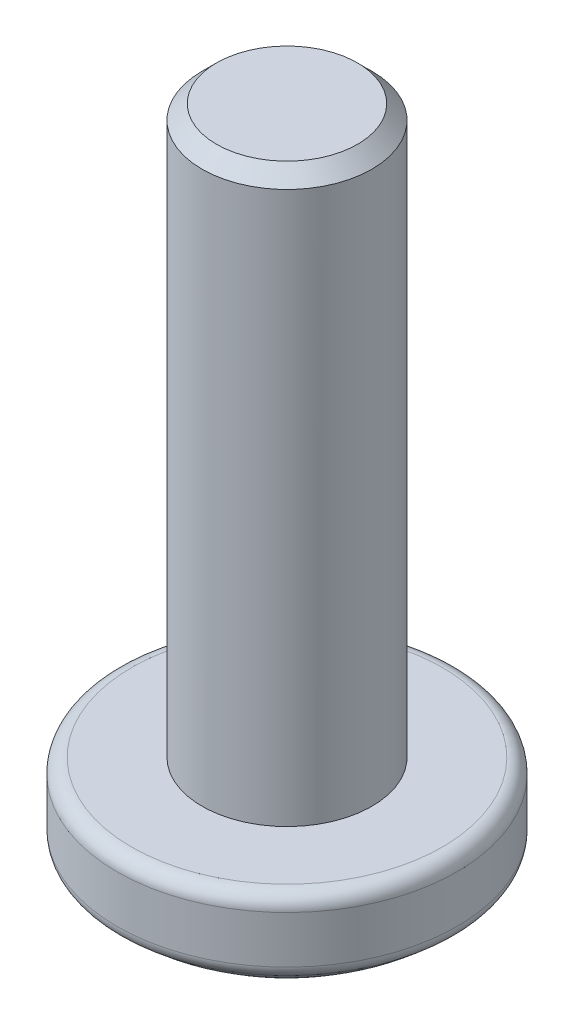
ISO-10303-21;
HEADER;
FILE_DESCRIPTION(('STEP AP214'),'2;1');
FILE_NAME('part.step','',(''),(''),'','','');
FILE_SCHEMA(('AUTOMOTIVE_DESIGN { 1 0 10303 214 1 1 1 1 }'));
ENDSEC;
DATA;
#1=APPLICATION_CONTEXT('core data for automotive mechanical design processes');
#2=APPLICATION_PROTOCOL_DEFINITION('international standard','automotive_design',2000,#1);
#3=PRODUCT_CONTEXT('',#1,'mechanical');
#4=PRODUCT('Part','Part','',(#3));
#5=PRODUCT_RELATED_PRODUCT_CATEGORY('part','',(#4));
#6=PRODUCT_DEFINITION_FORMATION('','',#4);
#7=PRODUCT_DEFINITION_CONTEXT('part definition',#1,'design');
#8=PRODUCT_DEFINITION('design','',#6,#7);
#9=PRODUCT_DEFINITION_SHAPE('','',#8);
#10=(LENGTH_UNIT() NAMED_UNIT(*) SI_UNIT(.MILLI.,.METRE.));
#11=(NAMED_UNIT(*) PLANE_ANGLE_UNIT() SI_UNIT($,.RADIAN.));
#12=(NAMED_UNIT(*) SI_UNIT($,.STERADIAN.) SOLID_ANGLE_UNIT());
#13=UNCERTAINTY_MEASURE_WITH_UNIT(LENGTH_MEASURE(1.E-05),#10,'distance_accuracy_value','');
#14=(GEOMETRIC_REPRESENTATION_CONTEXT(3) GLOBAL_UNCERTAINTY_ASSIGNED_CONTEXT((#13)) GLOBAL_UNIT_ASSIGNED_CONTEXT((#10,
#11,#12)) REPRESENTATION_CONTEXT('',''));
#15=CARTESIAN_POINT('',(0.,0.,0.));
#16=DIRECTION('',(0.,0.,1.));
#17=DIRECTION('',(1.,0.,0.));
#18=AXIS2_PLACEMENT_3D('',#15,#16,#17);
#19=CARTESIAN_POINT('',(0.,4.35,0.));
#20=DIRECTION('',(0.,-1.,0.));
#21=DIRECTION('',(-1.,0.,0.));
#22=AXIS2_PLACEMENT_3D('',#19,#20,#21);
#23=SPHERICAL_SURFACE('',#22,4.35);
#24=CARTESIAN_POINT('',(0.,1.122340386084,0.));
#25=DIRECTION('',(0.,1.,0.));
#26=DIRECTION('',(0.,0.,1.));
#27=AXIS2_PLACEMENT_3D('',#24,#25,#26);
#28=CIRCLE('',#27,2.9162841796875);
#29=CARTESIAN_POINT('',(0.,1.122340386084,2.9162841796875));
#30=VERTEX_POINT('',#29);
#31=EDGE_CURVE('E365',#30,#30,#28,.F.);
#32=ORIENTED_EDGE('',*,*,#31,.T.);
#33=EDGE_LOOP('',(#32));
#34=FACE_BOUND('',#33,.T.);
#35=CARTESIAN_POINT('',(0.258970656536856,4.30433648604077,0.));
#36=DIRECTION('',(0.984807753012208,-0.173648177666931,0.));
#37=DIRECTION('',(0.173648177666931,0.984807753012208,0.));
#38=AXIS2_PLACEMENT_3D('',#35,#36,#37);
#39=CIRCLE('',#38,4.34204433908105);
#40=CARTESIAN_POINT('',(-0.484894186436226,0.0856693258347679,0.709127301218796));
#41=VERTEX_POINT('',#40);
#42=CARTESIAN_POINT('',(-0.42720016888382,0.412868358680454,1.79972066016538));
#43=VERTEX_POINT('',#42);
#44=EDGE_CURVE('E11',#41,#43,#39,.F.);
#45=ORIENTED_EDGE('',*,*,#44,.T.);
#46=CARTESIAN_POINT('',(0.,0.412868358680454,0.));
#47=DIRECTION('',(0.,1.,0.));
#48=DIRECTION('',(0.,0.,1.));
#49=AXIS2_PLACEMENT_3D('',#46,#47,#48);
#50=CIRCLE('',#49,1.84972820676997);
#51=CARTESIAN_POINT('',(0.427200168883816,0.412868358680454,1.79972066016538));
#52=VERTEX_POINT('',#51);
#53=EDGE_CURVE('E382',#43,#52,#50,.T.);
#54=ORIENTED_EDGE('',*,*,#53,.T.);
#55=CARTESIAN_POINT('',(-0.258970656536853,4.30433648604077,0.));
#56=DIRECTION('',(-0.984807753012208,-0.173648177666931,0.));
#57=DIRECTION('',(0.173648177666931,-0.984807753012208,0.));
#58=AXIS2_PLACEMENT_3D('',#55,#56,#57);
#59=CIRCLE('',#58,4.34204433908105);
#60=CARTESIAN_POINT('',(0.484894186436226,0.0856693258347687,0.709127301218796));
#61=VERTEX_POINT('',#60);
#62=EDGE_CURVE('E51',#52,#61,#59,.F.);
#63=ORIENTED_EDGE('',*,*,#62,.T.);
#64=CARTESIAN_POINT('',(-0.0291757647507183,4.34443166091755,-0.012084997452354));
#65=DIRECTION('',(-0.909843726466414,-0.173648177666931,-0.376869611142454));
#66=DIRECTION('',(-0.38268343236508,0.,0.923879532511291));
#67=AXIS2_PLACEMENT_3D('',#64,#65,#66);
#68=CIRCLE('',#67,4.34988180542732);
#69=CARTESIAN_POINT('',(0.552581257723653,0.0707701735913865,0.552581257723651));
#70=VERTEX_POINT('',#69);
#71=EDGE_CURVE('E404',#61,#70,#68,.F.);
#72=ORIENTED_EDGE('',*,*,#71,.T.);
#73=CARTESIAN_POINT('',(-0.0120849974523541,4.34443166091755,-0.0291757647507182));
#74=DIRECTION('',(-0.376869611142458,-0.173648177666931,-0.909843726466412));
#75=DIRECTION('',(-0.923879532511289,0.,0.382683432365084));
#76=AXIS2_PLACEMENT_3D('',#73,#74,#75);
#77=CIRCLE('',#76,4.34988180542732);
#78=CARTESIAN_POINT('',(0.709127301218798,0.0856693258347687,0.484894186436223));
#79=VERTEX_POINT('',#78);
#80=EDGE_CURVE('E406',#70,#79,#77,.F.);
#81=ORIENTED_EDGE('',*,*,#80,.T.);
#82=CARTESIAN_POINT('',(0.,4.30433648604077,-0.258970656536856));
#83=DIRECTION('',(0.,-0.173648177666931,-0.984807753012208));
#84=DIRECTION('',(0.,0.984807753012208,-0.173648177666931));
#85=AXIS2_PLACEMENT_3D('',#82,#83,#84);
#86=CIRCLE('',#85,4.34204433908105);
#87=CARTESIAN_POINT('',(1.79972066016538,0.412868358680454,0.427200168883813));
#88=VERTEX_POINT('',#87);
#89=EDGE_CURVE('E317',#79,#88,#86,.F.);
#90=ORIENTED_EDGE('',*,*,#89,.T.);
#91=CARTESIAN_POINT('',(0.,0.412868358680454,0.));
#92=DIRECTION('',(0.,1.,0.));
#93=DIRECTION('',(0.,0.,1.));
#94=AXIS2_PLACEMENT_3D('',#91,#92,#93);
#95=CIRCLE('',#94,1.84972820676997);
#96=CARTESIAN_POINT('',(1.79972066016538,0.412868358680454,-0.427200168883797));
#97=VERTEX_POINT('',#96);
#98=EDGE_CURVE('E380',#88,#97,#95,.T.);
#99=ORIENTED_EDGE('',*,*,#98,.T.);
#100=CARTESIAN_POINT('',(0.,4.30433648604077,0.258970656536853));
#101=DIRECTION('',(0.,-0.173648177666931,0.984807753012208));
#102=DIRECTION('',(0.,-0.984807753012208,-0.173648177666931));
#103=AXIS2_PLACEMENT_3D('',#100,#101,#102);
#104=CIRCLE('',#103,4.34204433908105);
#105=CARTESIAN_POINT('',(0.709127301218801,0.0856693258347688,-0.484894186436219));
#106=VERTEX_POINT('',#105);
#107=EDGE_CURVE('E187',#97,#106,#104,.F.);
#108=ORIENTED_EDGE('',*,*,#107,.T.);
#109=CARTESIAN_POINT('',(-0.0120849974523544,4.34443166091755,0.0291757647507183));
#110=DIRECTION('',(-0.376869611142463,-0.173648177666931,0.90984372646641));
#111=DIRECTION('',(0.923879532511287,0.,0.38268343236509));
#112=AXIS2_PLACEMENT_3D('',#109,#110,#111);
#113=CIRCLE('',#112,4.34988180542732);
#114=CARTESIAN_POINT('',(0.552581257723657,0.0707701735913864,-0.552581257723647));
#115=VERTEX_POINT('',#114);
#116=EDGE_CURVE('E510',#106,#115,#113,.F.);
#117=ORIENTED_EDGE('',*,*,#116,.T.);
#118=CARTESIAN_POINT('',(-0.0291757647507181,4.34443166091755,0.0120849974523538));
#119=DIRECTION('',(-0.909843726466416,-0.173648177666931,0.376869611142448));
#120=DIRECTION('',(0.382683432365074,0.,0.923879532511293));
#121=AXIS2_PLACEMENT_3D('',#118,#119,#120);
#122=CIRCLE('',#121,4.34988180542732);
#123=CARTESIAN_POINT('',(0.48489418643623,0.0856693258347689,-0.709127301218794));
#124=VERTEX_POINT('',#123);
#125=EDGE_CURVE('E508',#115,#124,#122,.F.);
#126=ORIENTED_EDGE('',*,*,#125,.T.);
#127=CARTESIAN_POINT('',(-0.258970656536856,4.30433648604077,0.));
#128=DIRECTION('',(-0.984807753012208,-0.173648177666931,0.));
#129=DIRECTION('',(0.173648177666931,-0.984807753012208,0.));
#130=AXIS2_PLACEMENT_3D('',#127,#128,#129);
#131=CIRCLE('',#130,4.34204433908105);
#132=CARTESIAN_POINT('',(0.427200168883832,0.412868358680454,-1.79972066016537));
#133=VERTEX_POINT('',#132);
#134=EDGE_CURVE('E214',#124,#133,#131,.F.);
#135=ORIENTED_EDGE('',*,*,#134,.T.);
#136=CARTESIAN_POINT('',(0.,0.412868358680454,0.));
#137=DIRECTION('',(0.,1.,0.));
#138=DIRECTION('',(0.,0.,1.));
#139=AXIS2_PLACEMENT_3D('',#136,#137,#138);
#140=CIRCLE('',#139,1.84972820676997);
#141=CARTESIAN_POINT('',(-0.427200168883816,0.412868358680454,-1.79972066016538));
#142=VERTEX_POINT('',#141);
#143=EDGE_CURVE('E423',#133,#142,#140,.T.);
#144=ORIENTED_EDGE('',*,*,#143,.T.);
#145=CARTESIAN_POINT('',(0.258970656536853,4.30433648604077,0.));
#146=DIRECTION('',(0.984807753012208,-0.173648177666931,0.));
#147=DIRECTION('',(0.173648177666931,0.984807753012208,0.));
#148=AXIS2_PLACEMENT_3D('',#145,#146,#147);
#149=CIRCLE('',#148,4.34204433908105);
#150=CARTESIAN_POINT('',(-0.484894186436226,0.0856693258347687,-0.709127301218796));
#151=VERTEX_POINT('',#150);
#152=EDGE_CURVE('E248',#142,#151,#149,.F.);
#153=ORIENTED_EDGE('',*,*,#152,.T.);
#154=CARTESIAN_POINT('',(0.0291757647507183,4.34443166091755,0.012084997452354));
#155=DIRECTION('',(0.909843726466414,-0.173648177666931,0.376869611142454));
#156=DIRECTION('',(0.38268343236508,0.,-0.923879532511291));
#157=AXIS2_PLACEMENT_3D('',#154,#155,#156);
#158=CIRCLE('',#157,4.34988180542732);
#159=CARTESIAN_POINT('',(-0.552581257723653,0.0707701735913865,-0.552581257723651));
#160=VERTEX_POINT('',#159);
#161=EDGE_CURVE('E496',#151,#160,#158,.F.);
#162=ORIENTED_EDGE('',*,*,#161,.T.);
#163=CARTESIAN_POINT('',(0.0120849974523541,4.34443166091755,0.0291757647507182));
#164=DIRECTION('',(0.376869611142458,-0.173648177666931,0.909843726466412));
#165=DIRECTION('',(0.923879532511289,0.,-0.382683432365084));
#166=AXIS2_PLACEMENT_3D('',#163,#164,#165);
#167=CIRCLE('',#166,4.34988180542732);
#168=CARTESIAN_POINT('',(-0.709127301218798,0.0856693258347687,-0.484894186436223));
#169=VERTEX_POINT('',#168);
#170=EDGE_CURVE('E491',#160,#169,#167,.F.);
#171=ORIENTED_EDGE('',*,*,#170,.T.);
#172=CARTESIAN_POINT('',(0.,4.30433648604077,0.258970656536856));
#173=DIRECTION('',(0.,-0.173648177666931,0.984807753012208));
#174=DIRECTION('',(0.,-0.984807753012208,-0.173648177666931));
#175=AXIS2_PLACEMENT_3D('',#172,#173,#174);
#176=CIRCLE('',#175,4.34204433908105);
#177=CARTESIAN_POINT('',(-1.79972066016538,0.412868358680454,-0.427200168883813));
#178=VERTEX_POINT('',#177);
#179=EDGE_CURVE('E275',#169,#178,#176,.F.);
#180=ORIENTED_EDGE('',*,*,#179,.T.);
#181=CARTESIAN_POINT('',(0.,0.412868358680454,0.));
#182=DIRECTION('',(0.,1.,0.));
#183=DIRECTION('',(0.,0.,1.));
#184=AXIS2_PLACEMENT_3D('',#181,#182,#183);
#185=CIRCLE('',#184,1.84972820676997);
#186=CARTESIAN_POINT('',(-1.79972066016538,0.412868358680454,0.42720016888381));
#187=VERTEX_POINT('',#186);
#188=EDGE_CURVE('E417',#178,#187,#185,.T.);
#189=ORIENTED_EDGE('',*,*,#188,.T.);
#190=CARTESIAN_POINT('',(0.,4.30433648604077,-0.258970656536853));
#191=DIRECTION('',(0.,-0.173648177666931,-0.984807753012208));
#192=DIRECTION('',(0.,0.984807753012208,-0.173648177666931));
#193=AXIS2_PLACEMENT_3D('',#190,#191,#192);
#194=CIRCLE('',#193,4.34204433908105);
#195=CARTESIAN_POINT('',(-0.709127301218798,0.0856693258347687,0.484894186436224));
#196=VERTEX_POINT('',#195);
#197=EDGE_CURVE('E420',#187,#196,#194,.F.);
#198=ORIENTED_EDGE('',*,*,#197,.T.);
#199=CARTESIAN_POINT('',(0.0120849974523541,4.34443166091755,-0.0291757647507183));
#200=DIRECTION('',(0.376869611142457,-0.173648177666931,-0.909843726466412));
#201=DIRECTION('',(-0.92387953251129,0.,-0.382683432365083));
#202=AXIS2_PLACEMENT_3D('',#199,#200,#201);
#203=CIRCLE('',#202,4.34988180542732);
#204=CARTESIAN_POINT('',(-0.552581257723653,0.0707701735913865,0.552581257723651));
#205=VERTEX_POINT('',#204);
#206=EDGE_CURVE('E445',#196,#205,#203,.F.);
#207=ORIENTED_EDGE('',*,*,#206,.T.);
#208=CARTESIAN_POINT('',(0.029175764750718,4.34443166091755,-0.012084997452354));
#209=DIRECTION('',(0.909843726466413,-0.173648177666931,-0.376869611142455));
#210=DIRECTION('',(-0.382683432365081,0.,-0.923879532511291));
#211=AXIS2_PLACEMENT_3D('',#208,#209,#210);
#212=CIRCLE('',#211,4.34988180542732);
#213=EDGE_CURVE('E42',#205,#41,#212,.F.);
#214=ORIENTED_EDGE('',*,*,#213,.T.);
#215=EDGE_LOOP('',(#45,#54,#63,#72,#81,#90,#99,#108,#117,#126,#135,#144,#153,#162,#171,#180,
#189,#198,#207,#214));
#216=FACE_BOUND('',#215,.T.);
#217=ADVANCED_FACE('F32',(#34,#216),#23,.T.);
#218=CARTESIAN_POINT('',(1.5,12.4,0.));
#219=DIRECTION('',(0.,1.,0.));
#220=DIRECTION('',(0.,0.,1.));
#221=AXIS2_PLACEMENT_3D('',#218,#219,#220);
#222=PLANE('',#221);
#223=CARTESIAN_POINT('',(0.,12.4,0.));
#224=DIRECTION('',(0.,1.,0.));
#225=DIRECTION('',(0.,0.,1.));
#226=AXIS2_PLACEMENT_3D('',#223,#224,#225);
#227=CIRCLE('',#226,1.246);
#228=CARTESIAN_POINT('',(0.,12.4,1.246));
#229=VERTEX_POINT('',#228);
#230=EDGE_CURVE('E367',#229,#229,#227,.T.);
#231=ORIENTED_EDGE('',*,*,#230,.T.);
#232=EDGE_LOOP('',(#231));
#233=FACE_BOUND('',#232,.T.);
#234=ADVANCED_FACE('F336',(#233),#222,.T.);
#235=CARTESIAN_POINT('',(0.,0.,0.));
#236=DIRECTION('',(0.,-1.,0.));
#237=DIRECTION('',(0.,0.,-1.));
#238=AXIS2_PLACEMENT_3D('',#235,#236,#237);
#239=CYLINDRICAL_SURFACE('',#238,1.5);
#240=CARTESIAN_POINT('',(0.,12.146,0.));
#241=DIRECTION('',(0.,1.,0.));
#242=DIRECTION('',(0.,0.,1.));
#243=AXIS2_PLACEMENT_3D('',#240,#241,#242);
#244=CIRCLE('',#243,1.5);
#245=CARTESIAN_POINT('',(0.,12.146,1.5));
#246=VERTEX_POINT('',#245);
#247=EDGE_CURVE('E372',#246,#246,#244,.F.);
#248=ORIENTED_EDGE('',*,*,#247,.T.);
#249=EDGE_LOOP('',(#248));
#250=FACE_BOUND('',#249,.T.);
#251=CARTESIAN_POINT('',(0.,2.4,0.));
#252=DIRECTION('',(0.,-1.,0.));
#253=DIRECTION('',(0.,0.,-1.));
#254=AXIS2_PLACEMENT_3D('',#251,#252,#253);
#255=CIRCLE('',#254,1.5);
#256=CARTESIAN_POINT('',(0.,2.4,-1.5));
#257=VERTEX_POINT('',#256);
#258=EDGE_CURVE('E402',#257,#257,#255,.T.);
#259=ORIENTED_EDGE('',*,*,#258,.F.);
#260=EDGE_LOOP('',(#259));
#261=FACE_BOUND('',#260,.T.);
#262=ADVANCED_FACE('F342',(#250,#261),#239,.T.);
#263=CARTESIAN_POINT('',(3.,2.4,0.));
#264=DIRECTION('',(0.,1.,0.));
#265=DIRECTION('',(0.,0.,1.));
#266=AXIS2_PLACEMENT_3D('',#263,#264,#265);
#267=PLANE('',#266);
#268=CARTESIAN_POINT('',(0.,2.4,0.));
#269=DIRECTION('',(0.,1.,0.));
#270=DIRECTION('',(0.,0.,1.));
#271=AXIS2_PLACEMENT_3D('',#268,#269,#270);
#272=CIRCLE('',#271,2.746);
#273=CARTESIAN_POINT('',(0.,2.4,2.746));
#274=VERTEX_POINT('',#273);
#275=EDGE_CURVE('E377',#274,#274,#272,.T.);
#276=ORIENTED_EDGE('',*,*,#275,.T.);
#277=EDGE_LOOP('',(#276));
#278=FACE_BOUND('',#277,.T.);
#279=ORIENTED_EDGE('',*,*,#258,.T.);
#280=EDGE_LOOP('',(#279));
#281=FACE_BOUND('',#280,.T.);
#282=ADVANCED_FACE('F641',(#278,#281),#267,.T.);
#283=CARTESIAN_POINT('',(0.,0.,0.));
#284=DIRECTION('',(0.,-1.,0.));
#285=DIRECTION('',(0.,0.,-1.));
#286=AXIS2_PLACEMENT_3D('',#283,#284,#285);
#287=CYLINDRICAL_SURFACE('',#286,3.);
#288=CARTESIAN_POINT('',(0.,1.31080602790806,0.));
#289=DIRECTION('',(0.,1.,0.));
#290=DIRECTION('',(0.,0.,1.));
#291=AXIS2_PLACEMENT_3D('',#288,#289,#290);
#292=CIRCLE('',#291,3.);
#293=CARTESIAN_POINT('',(0.,1.31080602790806,3.));
#294=VERTEX_POINT('',#293);
#295=EDGE_CURVE('E363',#294,#294,#292,.T.);
#296=ORIENTED_EDGE('',*,*,#295,.T.);
#297=EDGE_LOOP('',(#296));
#298=FACE_BOUND('',#297,.T.);
#299=CARTESIAN_POINT('',(0.,2.146,0.));
#300=DIRECTION('',(0.,1.,0.));
#301=DIRECTION('',(0.,0.,1.));
#302=AXIS2_PLACEMENT_3D('',#299,#300,#301);
#303=CIRCLE('',#302,3.);
#304=CARTESIAN_POINT('',(0.,2.146,3.));
#305=VERTEX_POINT('',#304);
#306=EDGE_CURVE('E366',#305,#305,#303,.F.);
#307=ORIENTED_EDGE('',*,*,#306,.T.);
#308=EDGE_LOOP('',(#307));
#309=FACE_BOUND('',#308,.T.);
#310=ADVANCED_FACE('F352',(#298,#309),#287,.T.);
#311=CARTESIAN_POINT('',(0.,12.146,0.));
#312=DIRECTION('',(0.,-1.,0.));
#313=DIRECTION('',(0.,0.,-1.));
#314=AXIS2_PLACEMENT_3D('',#311,#312,#313);
#315=CONICAL_SURFACE('',#314,1.5,0.785398163397453);
#316=ORIENTED_EDGE('',*,*,#230,.F.);
#317=EDGE_LOOP('',(#316));
#318=FACE_BOUND('',#317,.T.);
#319=ORIENTED_EDGE('',*,*,#247,.F.);
#320=EDGE_LOOP('',(#319));
#321=FACE_BOUND('',#320,.T.);
#322=ADVANCED_FACE('F349',(#318,#321),#315,.T.);
#323=CARTESIAN_POINT('',(0.,1.31080602790806,0.));
#324=DIRECTION('',(0.,1.,0.));
#325=DIRECTION('',(0.,0.,1.));
#326=AXIS2_PLACEMENT_3D('',#323,#324,#325);
#327=TOROIDAL_SURFACE('',#326,2.746,0.254);
#328=ORIENTED_EDGE('',*,*,#295,.F.);
#329=EDGE_LOOP('',(#328));
#330=FACE_BOUND('',#329,.T.);
#331=ORIENTED_EDGE('',*,*,#31,.F.);
#332=EDGE_LOOP('',(#331));
#333=FACE_BOUND('',#332,.T.);
#334=ADVANCED_FACE('F351',(#330,#333),#327,.T.);
#335=CARTESIAN_POINT('',(0.,2.146,0.));
#336=DIRECTION('',(0.,1.,0.));
#337=DIRECTION('',(0.,0.,1.));
#338=AXIS2_PLACEMENT_3D('',#335,#336,#337);
#339=TOROIDAL_SURFACE('',#338,2.746,0.254);
#340=ORIENTED_EDGE('',*,*,#275,.F.);
#341=EDGE_LOOP('',(#340));
#342=FACE_BOUND('',#341,.T.);
#343=ORIENTED_EDGE('',*,*,#306,.F.);
#344=EDGE_LOOP('',(#343));
#345=FACE_BOUND('',#344,.T.);
#346=ADVANCED_FACE('F302',(#342,#345),#339,.T.);
#347=CARTESIAN_POINT('',(0.,0.,0.));
#348=DIRECTION('',(0.,-1.,0.));
#349=DIRECTION('',(0.,0.,-1.));
#350=AXIS2_PLACEMENT_3D('',#347,#348,#349);
#351=CONICAL_SURFACE('',#350,2.,0.349065850398867);
#352=ORIENTED_EDGE('',*,*,#53,.F.);
#353=CARTESIAN_POINT('',(-0.427200168883814,0.412868358680487,1.79972066016548));
#354=CARTESIAN_POINT('',(-0.389286175105566,0.627889302304162,1.72824125608089));
#355=CARTESIAN_POINT('',(-0.351385490847806,0.842834763886265,1.6565200732881));
#356=CARTESIAN_POINT('',(-0.275639714719868,1.27241040695347,1.51215063047957));
#357=CARTESIAN_POINT('',(-0.237794619982204,1.48704060470089,1.43950242029992));
#358=CARTESIAN_POINT('',(-0.181086343363749,1.80864922290898,1.32949453003816));
#359=CARTESIAN_POINT('',(-0.16219297484935,1.91579884027603,1.29265163946654));
#360=CARTESIAN_POINT('',(-0.124433168671837,2.12994534256285,1.21851297872001));
#361=CARTESIAN_POINT('',(-0.105566730840369,2.2369422284374,1.18121721139018));
#362=CARTESIAN_POINT('',(-0.0678678752263425,2.45074306290162,1.10603883061068));
#363=CARTESIAN_POINT('',(-0.0490354593591058,2.55754700062896,1.06815618520483));
#364=CARTESIAN_POINT('',(-0.0114205639153906,2.77087167330572,0.991570976083142));
#365=CARTESIAN_POINT('',(0.00736191456696406,2.87739240205006,0.952868394566499));
#366=CARTESIAN_POINT('',(0.0261115733701702,2.98372700114471,0.913639129514779));
#367=B_SPLINE_CURVE_WITH_KNOTS('',3,(#353,#354,#355,#356,#357,#358,#359,#360,#361,#362,#363,
#364,#365,#366),.UNSPECIFIED.,.F.,.F.,(4,2,2,2,2,2,4),(0.,0.689225785527144,1.37841467375089,
1.72302752905769,2.0676382205366,2.41226774287497,2.75690475479846),.UNSPECIFIED.);
#368=CARTESIAN_POINT('',(-0.147346038583071,2.,1.26349697131075));
#369=VERTEX_POINT('',#368);
#370=EDGE_CURVE('E436',#369,#43,#367,.F.);
#371=ORIENTED_EDGE('',*,*,#370,.F.);
#372=CARTESIAN_POINT('',(0.,2.,0.));
#373=DIRECTION('',(0.,1.,0.));
#374=DIRECTION('',(0.,0.,1.));
#375=AXIS2_PLACEMENT_3D('',#372,#373,#374);
#376=CIRCLE('',#375,1.27205953146759);
#377=CARTESIAN_POINT('',(0.14734603858307,2.,1.26349697131075));
#378=VERTEX_POINT('',#377);
#379=EDGE_CURVE('E385',#369,#378,#376,.T.);
#380=ORIENTED_EDGE('',*,*,#379,.T.);
#381=CARTESIAN_POINT('',(0.0961959809597622,2.29008639187146,1.16250344958252));
#382=CARTESIAN_POINT('',(0.128419405540513,2.10733826988083,1.22652723288619));
#383=CARTESIAN_POINT('',(0.160686194085589,1.92434421862769,1.28981873285545));
#384=CARTESIAN_POINT('',(0.225282776755482,1.5579987937225,1.41531573964388));
#385=CARTESIAN_POINT('',(0.257612569667517,1.37464742694846,1.47752126714199));
#386=CARTESIAN_POINT('',(0.32202293142225,1.00935811333385,1.6006733386335));
#387=CARTESIAN_POINT('',(0.354103139037547,0.827422215115655,1.66162616862896));
#388=CARTESIAN_POINT('',(0.418292632216687,0.46338550943832,1.78302283265837));
#389=CARTESIAN_POINT('',(0.450401917827159,0.281284701714742,1.84346666587453));
#390=CARTESIAN_POINT('',(0.514642878379865,-0.0830438899425974,1.96398191132411));
#391=CARTESIAN_POINT('',(0.546774554123209,-0.265271678419677,2.02405330938096));
#392=CARTESIAN_POINT('',(0.611054199733614,-0.629819663941435,2.14390330448741));
#393=CARTESIAN_POINT('',(0.643202169521065,-0.812139860534624,2.20368190295265));
#394=CARTESIAN_POINT('',(0.675356001070478,-0.994493300831864,2.26335535577293));
#395=B_SPLINE_CURVE_WITH_KNOTS('',3,(#381,#382,#383,#384,#385,#386,#387,#388,#389,#390,#391,
#392,#393,#394),.UNSPECIFIED.,.F.,.F.,(4,2,2,2,2,2,4),(0.,0.588898983680052,1.17778674136894,
1.76140022831259,2.34501465275221,2.92865115746137,3.51228483760131),.UNSPECIFIED.);
#396=EDGE_CURVE('E391',#378,#52,#395,.T.);
#397=ORIENTED_EDGE('',*,*,#396,.T.);
#398=EDGE_LOOP('',(#352,#371,#380,#397));
#399=FACE_BOUND('',#398,.T.);
#400=ADVANCED_FACE('F304',(#399),#351,.F.);
#401=CARTESIAN_POINT('',(0.5,0.,0.));
#402=DIRECTION('',(-0.984807753012208,-0.173648177666931,0.));
#403=DIRECTION('',(0.173648177666931,-0.984807753012208,0.));
#404=AXIS2_PLACEMENT_3D('',#401,#402,#403);
#405=PLANE('',#404);
#406=ORIENTED_EDGE('',*,*,#396,.F.);
#407=DIRECTION('',(0.,0.,-1.));
#408=VECTOR('',#407,1.);
#409=CARTESIAN_POINT('',(0.14734603858307,2.,0.));
#410=LINE('',#409,#408);
#411=CARTESIAN_POINT('',(0.14734603858307,2.,0.641984800024708));
#412=VERTEX_POINT('',#411);
#413=EDGE_CURVE('E387',#378,#412,#410,.T.);
#414=ORIENTED_EDGE('',*,*,#413,.T.);
#415=DIRECTION('',(0.173544683499998,-0.984220808424847,0.034520183841137));
#416=VECTOR('',#415,1.);
#417=CARTESIAN_POINT('',(0.495733763411424,0.0241950300029829,0.711283427136327));
#418=LINE('',#417,#416);
#419=EDGE_CURVE('E389',#412,#61,#418,.T.);
#420=ORIENTED_EDGE('',*,*,#419,.T.);
#421=ORIENTED_EDGE('',*,*,#62,.F.);
#422=EDGE_LOOP('',(#406,#414,#420,#421));
#423=FACE_BOUND('',#422,.T.);
#424=ADVANCED_FACE('F325',(#423),#405,.T.);
#425=CARTESIAN_POINT('',(0.678553390593272,0.,0.281066017177973));
#426=DIRECTION('',(-0.909843726466414,-0.173648177666931,-0.376869611142454));
#427=DIRECTION('',(-0.38268343236508,0.,0.923879532511291));
#428=AXIS2_PLACEMENT_3D('',#425,#426,#427);
#429=PLANE('',#428);
#430=ORIENTED_EDGE('',*,*,#419,.F.);
#431=DIRECTION('',(0.38268343236508,0.,-0.923879532511291));
#432=VECTOR('',#431,1.);
#433=CARTESIAN_POINT('',(0.352743613581143,2.,0.146111188785799));
#434=LINE('',#433,#432);
#435=CARTESIAN_POINT('',(0.292222377571608,2.,0.292222377571607));
#436=VERTEX_POINT('',#435);
#437=EDGE_CURVE('E413',#412,#436,#434,.T.);
#438=ORIENTED_EDGE('',*,*,#437,.T.);
#439=DIRECTION('',(0.13256209501801,-0.982270116581418,0.132562095018009));
#440=VECTOR('',#439,1.);
#441=CARTESIAN_POINT('',(0.559238781634994,0.0214386751140303,0.559238781634991));
#442=LINE('',#441,#440);
#443=EDGE_CURVE('E392',#436,#70,#442,.T.);
#444=ORIENTED_EDGE('',*,*,#443,.T.);
#445=ORIENTED_EDGE('',*,*,#71,.F.);
#446=EDGE_LOOP('',(#430,#438,#444,#445));
#447=FACE_BOUND('',#446,.T.);
#448=ADVANCED_FACE('F327',(#447),#429,.T.);
#449=CARTESIAN_POINT('',(0.281066017177976,0.,0.678553390593271));
#450=DIRECTION('',(-0.376869611142458,-0.173648177666931,-0.909843726466412));
#451=DIRECTION('',(-0.923879532511289,0.,0.382683432365084));
#452=AXIS2_PLACEMENT_3D('',#449,#450,#451);
#453=PLANE('',#452);
#454=ORIENTED_EDGE('',*,*,#443,.F.);
#455=DIRECTION('',(0.923879532511289,0.,-0.382683432365084));
#456=VECTOR('',#455,1.);
#457=CARTESIAN_POINT('',(0.146111188785801,2.,0.352743613581142));
#458=LINE('',#457,#456);
#459=CARTESIAN_POINT('',(0.641984800024709,2.,0.147346038583067));
#460=VERTEX_POINT('',#459);
#461=EDGE_CURVE('E411',#436,#460,#458,.T.);
#462=ORIENTED_EDGE('',*,*,#461,.T.);
#463=DIRECTION('',(0.0345201838411375,-0.984220808424847,0.173544683499998));
#464=VECTOR('',#463,1.);
#465=CARTESIAN_POINT('',(0.712688034162945,-0.0158523657356219,0.502795199787246));
#466=LINE('',#465,#464);
#467=EDGE_CURVE('E316',#460,#79,#466,.T.);
#468=ORIENTED_EDGE('',*,*,#467,.T.);
#469=ORIENTED_EDGE('',*,*,#80,.F.);
#470=EDGE_LOOP('',(#454,#462,#468,#469));
#471=FACE_BOUND('',#470,.T.);
#472=ADVANCED_FACE('F323',(#471),#453,.T.);
#473=CARTESIAN_POINT('',(0.,0.,0.499999999999998));
#474=DIRECTION('',(0.,-0.173648177666931,-0.984807753012208));
#475=DIRECTION('',(0.,0.984807753012208,-0.173648177666931));
#476=AXIS2_PLACEMENT_3D('',#473,#474,#475);
#477=PLANE('',#476);
#478=ORIENTED_EDGE('',*,*,#467,.F.);
#479=DIRECTION('',(1.,0.,0.));
#480=VECTOR('',#479,1.);
#481=CARTESIAN_POINT('',(0.,2.,0.147346038583067));
#482=LINE('',#481,#480);
#483=CARTESIAN_POINT('',(1.26349697131075,2.,0.147346038583067));
#484=VERTEX_POINT('',#483);
#485=EDGE_CURVE('E182',#460,#484,#482,.T.);
#486=ORIENTED_EDGE('',*,*,#485,.T.);
#487=CARTESIAN_POINT('',(1.79972066016548,0.412868358680487,0.427200168883808));
#488=CARTESIAN_POINT('',(1.72824125608089,0.627889302304162,0.38928617510556));
#489=CARTESIAN_POINT('',(1.6565200732881,0.842834763886265,0.3513854908478));
#490=CARTESIAN_POINT('',(1.51215063047957,1.27241040695347,0.275639714719863));
#491=CARTESIAN_POINT('',(1.43950242029992,1.48704060470089,0.237794619982199));
#492=CARTESIAN_POINT('',(1.32949453003816,1.80864922290898,0.181086343363745));
#493=CARTESIAN_POINT('',(1.29265163946654,1.91579884027603,0.162192974849346));
#494=CARTESIAN_POINT('',(1.21851297872001,2.12994534256285,0.124433168671832));
#495=CARTESIAN_POINT('',(1.18121721139018,2.2369422284374,0.105566730840364));
#496=CARTESIAN_POINT('',(1.10603883061068,2.45074306290162,0.0678678752263386));
#497=CARTESIAN_POINT('',(1.06815618520483,2.55754700062896,0.049035459359102));
#498=CARTESIAN_POINT('',(0.991570976083141,2.77087167330572,0.011420563915387));
#499=CARTESIAN_POINT('',(0.952868394566498,2.87739240205006,-0.00736191456696756));
#500=CARTESIAN_POINT('',(0.913639129514778,2.98372700114471,-0.0261115733701735));
#501=B_SPLINE_CURVE_WITH_KNOTS('',3,(#487,#488,#489,#490,#491,#492,#493,#494,#495,#496,#497,
#498,#499,#500),.UNSPECIFIED.,.F.,.F.,(4,2,2,2,2,2,4),(0.,0.689225785527144,1.37841467375089,
1.72302752905769,2.0676382205366,2.41226774287497,2.75690475479846),.UNSPECIFIED.);
#502=EDGE_CURVE('E179',#484,#88,#501,.F.);
#503=ORIENTED_EDGE('',*,*,#502,.T.);
#504=ORIENTED_EDGE('',*,*,#89,.F.);
#505=EDGE_LOOP('',(#478,#486,#503,#504));
#506=FACE_BOUND('',#505,.T.);
#507=ADVANCED_FACE('F301',(#506),#477,.T.);
#508=CARTESIAN_POINT('',(0.,0.,0.));
#509=DIRECTION('',(0.,-1.,0.));
#510=DIRECTION('',(0.,0.,-1.));
#511=AXIS2_PLACEMENT_3D('',#508,#509,#510);
#512=CONICAL_SURFACE('',#511,2.,0.349065850398867);
#513=ORIENTED_EDGE('',*,*,#502,.F.);
#514=CARTESIAN_POINT('',(0.,2.,0.));
#515=DIRECTION('',(0.,1.,0.));
#516=DIRECTION('',(0.,0.,1.));
#517=AXIS2_PLACEMENT_3D('',#514,#515,#516);
#518=CIRCLE('',#517,1.27205953146759);
#519=CARTESIAN_POINT('',(1.26349697131075,2.,-0.147346038583057));
#520=VERTEX_POINT('',#519);
#521=EDGE_CURVE('E175',#484,#520,#518,.T.);
#522=ORIENTED_EDGE('',*,*,#521,.T.);
#523=CARTESIAN_POINT('',(1.16250344958252,2.29008639187146,-0.0961959809597501));
#524=CARTESIAN_POINT('',(1.22652723288619,2.10733826988083,-0.1284194055405));
#525=CARTESIAN_POINT('',(1.28981873285545,1.92434421862769,-0.160686194085576));
#526=CARTESIAN_POINT('',(1.41531573964388,1.5579987937225,-0.225282776755467));
#527=CARTESIAN_POINT('',(1.47752126714199,1.37464742694846,-0.257612569667502));
#528=CARTESIAN_POINT('',(1.6006733386335,1.00935811333385,-0.322022931422233));
#529=CARTESIAN_POINT('',(1.66162616862896,0.827422215115656,-0.354103139037529));
#530=CARTESIAN_POINT('',(1.78302283265838,0.463385509438321,-0.418292632216669));
#531=CARTESIAN_POINT('',(1.84346666587454,0.281284701714743,-0.450401917827139));
#532=CARTESIAN_POINT('',(1.96398191132411,-0.0830438899425966,-0.514642878379844));
#533=CARTESIAN_POINT('',(2.02405330938096,-0.265271678419676,-0.546774554123188));
#534=CARTESIAN_POINT('',(2.14390330448742,-0.629819663941434,-0.611054199733591));
#535=CARTESIAN_POINT('',(2.20368190295266,-0.812139860534624,-0.643202169521042));
#536=CARTESIAN_POINT('',(2.26335535577294,-0.994493300831862,-0.675356001070455));
#537=B_SPLINE_CURVE_WITH_KNOTS('',3,(#523,#524,#525,#526,#527,#528,#529,#530,#531,#532,#533,
#534,#535,#536),.UNSPECIFIED.,.F.,.F.,(4,2,2,2,2,2,4),(0.,0.588898983680052,1.17778674136894,
1.76140022831259,2.34501465275221,2.92865115746137,3.51228483760131),.UNSPECIFIED.);
#538=EDGE_CURVE('E177',#520,#97,#537,.T.);
#539=ORIENTED_EDGE('',*,*,#538,.T.);
#540=ORIENTED_EDGE('',*,*,#98,.F.);
#541=EDGE_LOOP('',(#513,#522,#539,#540));
#542=FACE_BOUND('',#541,.T.);
#543=ADVANCED_FACE('F176',(#542),#512,.F.);
#544=CARTESIAN_POINT('',(0.,2.,0.));
#545=DIRECTION('',(0.,1.,0.));
#546=DIRECTION('',(0.,0.,1.));
#547=AXIS2_PLACEMENT_3D('',#544,#545,#546);
#548=PLANE('',#547);
#549=ORIENTED_EDGE('',*,*,#379,.F.);
#550=DIRECTION('',(0.,0.,1.));
#551=VECTOR('',#550,1.);
#552=CARTESIAN_POINT('',(-0.147346038583067,2.,0.));
#553=LINE('',#552,#551);
#554=CARTESIAN_POINT('',(-0.147346038583069,2.,0.641984800024709));
#555=VERTEX_POINT('',#554);
#556=EDGE_CURVE('E456',#555,#369,#553,.T.);
#557=ORIENTED_EDGE('',*,*,#556,.F.);
#558=DIRECTION('',(0.382683432365081,0.,0.923879532511291));
#559=VECTOR('',#558,1.);
#560=CARTESIAN_POINT('',(-0.352743613581143,2.,0.1461111887858));
#561=LINE('',#560,#559);
#562=CARTESIAN_POINT('',(-0.292222377571608,2.,0.292222377571607));
#563=VERTEX_POINT('',#562);
#564=EDGE_CURVE('E477',#563,#555,#561,.T.);
#565=ORIENTED_EDGE('',*,*,#564,.F.);
#566=DIRECTION('',(0.92387953251129,0.,0.382683432365083));
#567=VECTOR('',#566,1.);
#568=CARTESIAN_POINT('',(-0.1461111887858,2.,0.352743613581143));
#569=LINE('',#568,#567);
#570=CARTESIAN_POINT('',(-0.641984800024709,2.,0.147346038583067));
#571=VERTEX_POINT('',#570);
#572=EDGE_CURVE('E472',#571,#563,#569,.T.);
#573=ORIENTED_EDGE('',*,*,#572,.F.);
#574=DIRECTION('',(1.,0.,0.));
#575=VECTOR('',#574,1.);
#576=CARTESIAN_POINT('',(0.,2.,0.14734603858307));
#577=LINE('',#576,#575);
#578=CARTESIAN_POINT('',(-1.26349697131075,2.,0.147346038583065));
#579=VERTEX_POINT('',#578);
#580=EDGE_CURVE('E422',#579,#571,#577,.T.);
#581=ORIENTED_EDGE('',*,*,#580,.F.);
#582=CARTESIAN_POINT('',(0.,2.,0.));
#583=DIRECTION('',(0.,1.,0.));
#584=DIRECTION('',(0.,0.,1.));
#585=AXIS2_PLACEMENT_3D('',#582,#583,#584);
#586=CIRCLE('',#585,1.27205953146759);
#587=CARTESIAN_POINT('',(-1.26349697131075,2.,-0.147346038583067));
#588=VERTEX_POINT('',#587);
#589=EDGE_CURVE('E244',#588,#579,#586,.T.);
#590=ORIENTED_EDGE('',*,*,#589,.F.);
#591=DIRECTION('',(-1.,0.,0.));
#592=VECTOR('',#591,1.);
#593=CARTESIAN_POINT('',(0.,2.,-0.147346038583067));
#594=LINE('',#593,#592);
#595=CARTESIAN_POINT('',(-0.641984800024709,2.,-0.147346038583067));
#596=VERTEX_POINT('',#595);
#597=EDGE_CURVE('E274',#596,#588,#594,.T.);
#598=ORIENTED_EDGE('',*,*,#597,.F.);
#599=DIRECTION('',(-0.923879532511289,0.,0.382683432365084));
#600=VECTOR('',#599,1.);
#601=CARTESIAN_POINT('',(-0.146111188785801,2.,-0.352743613581142));
#602=LINE('',#601,#600);
#603=CARTESIAN_POINT('',(-0.292222377571608,2.,-0.292222377571607));
#604=VERTEX_POINT('',#603);
#605=EDGE_CURVE('E279',#604,#596,#602,.T.);
#606=ORIENTED_EDGE('',*,*,#605,.F.);
#607=DIRECTION('',(-0.38268343236508,0.,0.923879532511291));
#608=VECTOR('',#607,1.);
#609=CARTESIAN_POINT('',(-0.352743613581143,2.,-0.146111188785799));
#610=LINE('',#609,#608);
#611=CARTESIAN_POINT('',(-0.14734603858307,2.,-0.641984800024708));
#612=VERTEX_POINT('',#611);
#613=EDGE_CURVE('E281',#612,#604,#610,.T.);
#614=ORIENTED_EDGE('',*,*,#613,.F.);
#615=DIRECTION('',(0.,0.,1.));
#616=VECTOR('',#615,1.);
#617=CARTESIAN_POINT('',(-0.14734603858307,2.,0.));
#618=LINE('',#617,#616);
#619=CARTESIAN_POINT('',(-0.14734603858307,2.,-1.26349697131075));
#620=VERTEX_POINT('',#619);
#621=EDGE_CURVE('E283',#620,#612,#618,.T.);
#622=ORIENTED_EDGE('',*,*,#621,.F.);
#623=CARTESIAN_POINT('',(0.,2.,0.));
#624=DIRECTION('',(0.,1.,0.));
#625=DIRECTION('',(0.,0.,1.));
#626=AXIS2_PLACEMENT_3D('',#623,#624,#625);
#627=CIRCLE('',#626,1.27205953146759);
#628=CARTESIAN_POINT('',(0.14734603858308,2.,-1.26349697131075));
#629=VERTEX_POINT('',#628);
#630=EDGE_CURVE('E188',#629,#620,#627,.T.);
#631=ORIENTED_EDGE('',*,*,#630,.F.);
#632=DIRECTION('',(0.,0.,-1.));
#633=VECTOR('',#632,1.);
#634=CARTESIAN_POINT('',(0.147346038583067,2.,0.));
#635=LINE('',#634,#633);
#636=CARTESIAN_POINT('',(0.147346038583074,2.,-0.641984800024708));
#637=VERTEX_POINT('',#636);
#638=EDGE_CURVE('E199',#637,#629,#635,.T.);
#639=ORIENTED_EDGE('',*,*,#638,.F.);
#640=DIRECTION('',(-0.382683432365074,0.,-0.923879532511293));
#641=VECTOR('',#640,1.);
#642=CARTESIAN_POINT('',(0.352743613581144,2.,-0.146111188785797));
#643=LINE('',#642,#641);
#644=CARTESIAN_POINT('',(0.29222237757161,2.,-0.292222377571605));
#645=VERTEX_POINT('',#644);
#646=EDGE_CURVE('E195',#645,#637,#643,.T.);
#647=ORIENTED_EDGE('',*,*,#646,.F.);
#648=DIRECTION('',(-0.923879532511287,0.,-0.38268343236509));
#649=VECTOR('',#648,1.);
#650=CARTESIAN_POINT('',(0.146111188785803,2.,-0.352743613581142));
#651=LINE('',#650,#649);
#652=CARTESIAN_POINT('',(0.641984800024709,2.,-0.147346038583063));
#653=VERTEX_POINT('',#652);
#654=EDGE_CURVE('E194',#653,#645,#651,.T.);
#655=ORIENTED_EDGE('',*,*,#654,.F.);
#656=DIRECTION('',(-1.,0.,0.));
#657=VECTOR('',#656,1.);
#658=CARTESIAN_POINT('',(0.,2.,-0.14734603858307));
#659=LINE('',#658,#657);
#660=EDGE_CURVE('E36',#520,#653,#659,.T.);
#661=ORIENTED_EDGE('',*,*,#660,.F.);
#662=ORIENTED_EDGE('',*,*,#521,.F.);
#663=ORIENTED_EDGE('',*,*,#485,.F.);
#664=ORIENTED_EDGE('',*,*,#461,.F.);
#665=ORIENTED_EDGE('',*,*,#437,.F.);
#666=ORIENTED_EDGE('',*,*,#413,.F.);
#667=EDGE_LOOP('',(#549,#557,#565,#573,#581,#590,#598,#606,#614,#622,#631,#639,#647,#655,#661,
#662,#663,#664,#665,#666));
#668=FACE_BOUND('',#667,.T.);
#669=ADVANCED_FACE('F192',(#668),#548,.F.);
#670=CARTESIAN_POINT('',(0.,0.,0.));
#671=DIRECTION('',(0.,-1.,0.));
#672=DIRECTION('',(0.,0.,-1.));
#673=AXIS2_PLACEMENT_3D('',#670,#671,#672);
#674=CONICAL_SURFACE('',#673,2.,0.349065850398867);
#675=CARTESIAN_POINT('',(-1.79972066016548,0.412868358680487,-0.427200168883807));
#676=CARTESIAN_POINT('',(-1.72824125608089,0.627889302304162,-0.38928617510556));
#677=CARTESIAN_POINT('',(-1.6565200732881,0.842834763886266,-0.3513854908478));
#678=CARTESIAN_POINT('',(-1.51215063047957,1.27241040695347,-0.275639714719862));
#679=CARTESIAN_POINT('',(-1.43950242029992,1.48704060470089,-0.237794619982199));
#680=CARTESIAN_POINT('',(-1.32949453003816,1.80864922290898,-0.181086343363745));
#681=CARTESIAN_POINT('',(-1.29265163946654,1.91579884027603,-0.162192974849345));
#682=CARTESIAN_POINT('',(-1.21851297872001,2.12994534256285,-0.124433168671832));
#683=CARTESIAN_POINT('',(-1.18121721139018,2.2369422284374,-0.105566730840364));
#684=CARTESIAN_POINT('',(-1.10603883061068,2.45074306290162,-0.0678678752263386));
#685=CARTESIAN_POINT('',(-1.06815618520483,2.55754700062896,-0.049035459359102));
#686=CARTESIAN_POINT('',(-0.991570976083141,2.77087167330572,-0.011420563915387));
#687=CARTESIAN_POINT('',(-0.952868394566499,2.87739240205006,0.00736191456696753));
#688=CARTESIAN_POINT('',(-0.913639129514778,2.98372700114471,0.0261115733701735));
#689=B_SPLINE_CURVE_WITH_KNOTS('',3,(#675,#676,#677,#678,#679,#680,#681,#682,#683,#684,#685,
#686,#687,#688),.UNSPECIFIED.,.F.,.F.,(4,2,2,2,2,2,4),(0.,0.689225785527144,1.37841467375089,
1.72302752905769,2.0676382205366,2.41226774287497,2.75690475479846),.UNSPECIFIED.);
#690=EDGE_CURVE('E266',#588,#178,#689,.F.);
#691=ORIENTED_EDGE('',*,*,#690,.F.);
#692=ORIENTED_EDGE('',*,*,#589,.T.);
#693=CARTESIAN_POINT('',(-1.16250344958252,2.29008639187146,0.096195980959758));
#694=CARTESIAN_POINT('',(-1.22652723288619,2.10733826988083,0.128419405540508));
#695=CARTESIAN_POINT('',(-1.28981873285545,1.92434421862769,0.160686194085585));
#696=CARTESIAN_POINT('',(-1.41531573964388,1.5579987937225,0.225282776755477));
#697=CARTESIAN_POINT('',(-1.47752126714199,1.37464742694846,0.257612569667512));
#698=CARTESIAN_POINT('',(-1.6006733386335,1.00935811333385,0.322022931422245));
#699=CARTESIAN_POINT('',(-1.66162616862896,0.827422215115655,0.354103139037541));
#700=CARTESIAN_POINT('',(-1.78302283265838,0.46338550943832,0.418292632216681));
#701=CARTESIAN_POINT('',(-1.84346666587453,0.281284701714742,0.450401917827152));
#702=CARTESIAN_POINT('',(-1.96398191132411,-0.0830438899425979,0.514642878379858));
#703=CARTESIAN_POINT('',(-2.02405330938096,-0.265271678419677,0.546774554123202));
#704=CARTESIAN_POINT('',(-2.14390330448741,-0.629819663941435,0.611054199733607));
#705=CARTESIAN_POINT('',(-2.20368190295266,-0.812139860534624,0.643202169521057));
#706=CARTESIAN_POINT('',(-2.26335535577294,-0.994493300831864,0.675356001070471));
#707=B_SPLINE_CURVE_WITH_KNOTS('',3,(#693,#694,#695,#696,#697,#698,#699,#700,#701,#702,#703,
#704,#705,#706),.UNSPECIFIED.,.F.,.F.,(4,2,2,2,2,2,4),(0.,0.588898983680052,1.17778674136894,
1.76140022831259,2.34501465275221,2.92865115746137,3.51228483760131),.UNSPECIFIED.);
#708=EDGE_CURVE('E388',#579,#187,#707,.T.);
#709=ORIENTED_EDGE('',*,*,#708,.T.);
#710=ORIENTED_EDGE('',*,*,#188,.F.);
#711=EDGE_LOOP('',(#691,#692,#709,#710));
#712=FACE_BOUND('',#711,.T.);
#713=ADVANCED_FACE('F227',(#712),#674,.F.);
#714=CARTESIAN_POINT('',(0.,0.,0.5));
#715=DIRECTION('',(0.,-0.173648177666931,-0.984807753012208));
#716=DIRECTION('',(0.,0.984807753012208,-0.173648177666931));
#717=AXIS2_PLACEMENT_3D('',#714,#715,#716);
#718=PLANE('',#717);
#719=ORIENTED_EDGE('',*,*,#708,.F.);
#720=ORIENTED_EDGE('',*,*,#580,.T.);
#721=DIRECTION('',(-0.0345201838411377,-0.984220808424847,0.173544683499998));
#722=VECTOR('',#721,1.);
#723=CARTESIAN_POINT('',(-0.711283427136328,0.024195030002983,0.495733763411421));
#724=LINE('',#723,#722);
#725=EDGE_CURVE('E427',#571,#196,#724,.T.);
#726=ORIENTED_EDGE('',*,*,#725,.T.);
#727=ORIENTED_EDGE('',*,*,#197,.F.);
#728=EDGE_LOOP('',(#719,#720,#726,#727));
#729=FACE_BOUND('',#728,.T.);
#730=ADVANCED_FACE('F230',(#729),#718,.T.);
#731=CARTESIAN_POINT('',(-0.281066017177975,0.,0.678553390593271));
#732=DIRECTION('',(0.376869611142457,-0.173648177666931,-0.909843726466412));
#733=DIRECTION('',(-0.92387953251129,0.,-0.382683432365083));
#734=AXIS2_PLACEMENT_3D('',#731,#732,#733);
#735=PLANE('',#734);
#736=ORIENTED_EDGE('',*,*,#725,.F.);
#737=ORIENTED_EDGE('',*,*,#572,.T.);
#738=DIRECTION('',(-0.13256209501801,-0.982270116581418,0.132562095018009));
#739=VECTOR('',#738,1.);
#740=CARTESIAN_POINT('',(-0.559238781634993,0.0214386751140302,0.559238781634992));
#741=LINE('',#740,#739);
#742=EDGE_CURVE('E430',#563,#205,#741,.T.);
#743=ORIENTED_EDGE('',*,*,#742,.T.);
#744=ORIENTED_EDGE('',*,*,#206,.F.);
#745=EDGE_LOOP('',(#736,#737,#743,#744));
#746=FACE_BOUND('',#745,.T.);
#747=ADVANCED_FACE('F461',(#746),#735,.T.);
#748=CARTESIAN_POINT('',(-0.678553390593272,0.,0.281066017177974));
#749=DIRECTION('',(0.909843726466413,-0.173648177666931,-0.376869611142455));
#750=DIRECTION('',(-0.382683432365081,0.,-0.923879532511291));
#751=AXIS2_PLACEMENT_3D('',#748,#749,#750);
#752=PLANE('',#751);
#753=ORIENTED_EDGE('',*,*,#742,.F.);
#754=ORIENTED_EDGE('',*,*,#564,.T.);
#755=DIRECTION('',(-0.173544683499998,-0.984220808424847,0.0345201838411368));
#756=VECTOR('',#755,1.);
#757=CARTESIAN_POINT('',(-0.502795199787249,-0.0158523657356219,0.712688034162943));
#758=LINE('',#757,#756);
#759=EDGE_CURVE('E433',#555,#41,#758,.T.);
#760=ORIENTED_EDGE('',*,*,#759,.T.);
#761=ORIENTED_EDGE('',*,*,#213,.F.);
#762=EDGE_LOOP('',(#753,#754,#760,#761));
#763=FACE_BOUND('',#762,.T.);
#764=ADVANCED_FACE('F256',(#763),#752,.T.);
#765=CARTESIAN_POINT('',(-0.499999999999998,0.,0.));
#766=DIRECTION('',(0.984807753012208,-0.173648177666931,0.));
#767=DIRECTION('',(0.173648177666931,0.984807753012208,0.));
#768=AXIS2_PLACEMENT_3D('',#765,#766,#767);
#769=PLANE('',#768);
#770=ORIENTED_EDGE('',*,*,#759,.F.);
#771=ORIENTED_EDGE('',*,*,#556,.T.);
#772=ORIENTED_EDGE('',*,*,#370,.T.);
#773=ORIENTED_EDGE('',*,*,#44,.F.);
#774=EDGE_LOOP('',(#770,#771,#772,#773));
#775=FACE_BOUND('',#774,.T.);
#776=ADVANCED_FACE('F225',(#775),#769,.T.);
#777=CARTESIAN_POINT('',(0.,0.,0.));
#778=DIRECTION('',(0.,-1.,0.));
#779=DIRECTION('',(0.,0.,-1.));
#780=AXIS2_PLACEMENT_3D('',#777,#778,#779);
#781=CONICAL_SURFACE('',#780,2.,0.349065850398867);
#782=CARTESIAN_POINT('',(0.427200168883826,0.412868358680488,-1.79972066016548));
#783=CARTESIAN_POINT('',(0.389286175105578,0.627889302304163,-1.72824125608089));
#784=CARTESIAN_POINT('',(0.351385490847817,0.842834763886266,-1.6565200732881));
#785=CARTESIAN_POINT('',(0.275639714719878,1.27241040695347,-1.51215063047957));
#786=CARTESIAN_POINT('',(0.237794619982214,1.48704060470089,-1.43950242029992));
#787=CARTESIAN_POINT('',(0.181086343363759,1.80864922290898,-1.32949453003816));
#788=CARTESIAN_POINT('',(0.162192974849359,1.91579884027603,-1.29265163946654));
#789=CARTESIAN_POINT('',(0.124433168671845,2.12994534256285,-1.21851297872001));
#790=CARTESIAN_POINT('',(0.105566730840377,2.2369422284374,-1.18121721139018));
#791=CARTESIAN_POINT('',(0.0678678752263501,2.45074306290162,-1.10603883061068));
#792=CARTESIAN_POINT('',(0.0490354593591131,2.55754700062896,-1.06815618520483));
#793=CARTESIAN_POINT('',(0.0114205639153974,2.77087167330572,-0.991570976083141));
#794=CARTESIAN_POINT('',(-0.00736191456695753,2.87739240205006,-0.952868394566499));
#795=CARTESIAN_POINT('',(-0.026111573370164,2.98372700114471,-0.913639129514778));
#796=B_SPLINE_CURVE_WITH_KNOTS('',3,(#782,#783,#784,#785,#786,#787,#788,#789,#790,#791,#792,
#793,#794,#795),.UNSPECIFIED.,.F.,.F.,(4,2,2,2,2,2,4),(0.,0.689225785527144,1.37841467375089,
1.72302752905769,2.0676382205366,2.41226774287497,2.75690475479846),.UNSPECIFIED.);
#797=EDGE_CURVE('E204',#629,#133,#796,.F.);
#798=ORIENTED_EDGE('',*,*,#797,.F.);
#799=ORIENTED_EDGE('',*,*,#630,.T.);
#800=CARTESIAN_POINT('',(-0.0961959809597619,2.29008639187146,-1.16250344958252));
#801=CARTESIAN_POINT('',(-0.128419405540512,2.10733826988083,-1.22652723288619));
#802=CARTESIAN_POINT('',(-0.160686194085589,1.92434421862769,-1.28981873285544));
#803=CARTESIAN_POINT('',(-0.225282776755481,1.5579987937225,-1.41531573964388));
#804=CARTESIAN_POINT('',(-0.257612569667517,1.37464742694846,-1.47752126714199));
#805=CARTESIAN_POINT('',(-0.32202293142225,1.00935811333385,-1.6006733386335));
#806=CARTESIAN_POINT('',(-0.354103139037546,0.827422215115656,-1.66162616862896));
#807=CARTESIAN_POINT('',(-0.418292632216687,0.463385509438321,-1.78302283265837));
#808=CARTESIAN_POINT('',(-0.450401917827159,0.281284701714743,-1.84346666587453));
#809=CARTESIAN_POINT('',(-0.514642878379865,-0.0830438899425966,-1.96398191132411));
#810=CARTESIAN_POINT('',(-0.546774554123209,-0.265271678419676,-2.02405330938095));
#811=CARTESIAN_POINT('',(-0.611054199733614,-0.629819663941434,-2.14390330448741));
#812=CARTESIAN_POINT('',(-0.643202169521065,-0.812139860534623,-2.20368190295265));
#813=CARTESIAN_POINT('',(-0.675356001070478,-0.994493300831862,-2.26335535577293));
#814=B_SPLINE_CURVE_WITH_KNOTS('',3,(#800,#801,#802,#803,#804,#805,#806,#807,#808,#809,#810,
#811,#812,#813),.UNSPECIFIED.,.F.,.F.,(4,2,2,2,2,2,4),(0.,0.588898983680053,1.17778674136894,
1.76140022831259,2.34501465275221,2.92865115746137,3.51228483760131),.UNSPECIFIED.);
#815=EDGE_CURVE('E235',#620,#142,#814,.T.);
#816=ORIENTED_EDGE('',*,*,#815,.T.);
#817=ORIENTED_EDGE('',*,*,#143,.F.);
#818=EDGE_LOOP('',(#798,#799,#816,#817));
#819=FACE_BOUND('',#818,.T.);
#820=ADVANCED_FACE('F219',(#819),#781,.F.);
#821=CARTESIAN_POINT('',(-0.5,0.,0.));
#822=DIRECTION('',(0.984807753012208,-0.173648177666931,0.));
#823=DIRECTION('',(0.173648177666931,0.984807753012208,0.));
#824=AXIS2_PLACEMENT_3D('',#821,#822,#823);
#825=PLANE('',#824);
#826=ORIENTED_EDGE('',*,*,#815,.F.);
#827=ORIENTED_EDGE('',*,*,#621,.T.);
#828=DIRECTION('',(-0.173544683499998,-0.984220808424847,-0.034520183841137));
#829=VECTOR('',#828,1.);
#830=CARTESIAN_POINT('',(-0.495733763411424,0.0241950300029829,-0.711283427136327));
#831=LINE('',#830,#829);
#832=EDGE_CURVE('E245',#612,#151,#831,.T.);
#833=ORIENTED_EDGE('',*,*,#832,.T.);
#834=ORIENTED_EDGE('',*,*,#152,.F.);
#835=EDGE_LOOP('',(#826,#827,#833,#834));
#836=FACE_BOUND('',#835,.T.);
#837=ADVANCED_FACE('F224',(#836),#825,.T.);
#838=CARTESIAN_POINT('',(-0.678553390593272,0.,-0.281066017177973));
#839=DIRECTION('',(0.909843726466414,-0.173648177666931,0.376869611142454));
#840=DIRECTION('',(0.38268343236508,0.,-0.923879532511291));
#841=AXIS2_PLACEMENT_3D('',#838,#839,#840);
#842=PLANE('',#841);
#843=ORIENTED_EDGE('',*,*,#832,.F.);
#844=ORIENTED_EDGE('',*,*,#613,.T.);
#845=DIRECTION('',(-0.13256209501801,-0.982270116581418,-0.132562095018009));
#846=VECTOR('',#845,1.);
#847=CARTESIAN_POINT('',(-0.559238781634994,0.0214386751140303,-0.559238781634991));
#848=LINE('',#847,#846);
#849=EDGE_CURVE('E482',#604,#160,#848,.T.);
#850=ORIENTED_EDGE('',*,*,#849,.T.);
#851=ORIENTED_EDGE('',*,*,#161,.F.);
#852=EDGE_LOOP('',(#843,#844,#850,#851));
#853=FACE_BOUND('',#852,.T.);
#854=ADVANCED_FACE('F254',(#853),#842,.T.);
#855=CARTESIAN_POINT('',(-0.281066017177976,0.,-0.678553390593271));
#856=DIRECTION('',(0.376869611142458,-0.173648177666931,0.909843726466412));
#857=DIRECTION('',(0.923879532511289,0.,-0.382683432365084));
#858=AXIS2_PLACEMENT_3D('',#855,#856,#857);
#859=PLANE('',#858);
#860=ORIENTED_EDGE('',*,*,#849,.F.);
#861=ORIENTED_EDGE('',*,*,#605,.T.);
#862=DIRECTION('',(-0.0345201838411375,-0.984220808424847,-0.173544683499998));
#863=VECTOR('',#862,1.);
#864=CARTESIAN_POINT('',(-0.712688034162945,-0.0158523657356219,-0.502795199787246));
#865=LINE('',#864,#863);
#866=EDGE_CURVE('E246',#596,#169,#865,.T.);
#867=ORIENTED_EDGE('',*,*,#866,.T.);
#868=ORIENTED_EDGE('',*,*,#170,.F.);
#869=EDGE_LOOP('',(#860,#861,#867,#868));
#870=FACE_BOUND('',#869,.T.);
#871=ADVANCED_FACE('F262',(#870),#859,.T.);
#872=CARTESIAN_POINT('',(0.,0.,-0.499999999999998));
#873=DIRECTION('',(0.,-0.173648177666931,0.984807753012208));
#874=DIRECTION('',(0.,-0.984807753012208,-0.173648177666931));
#875=AXIS2_PLACEMENT_3D('',#872,#873,#874);
#876=PLANE('',#875);
#877=ORIENTED_EDGE('',*,*,#866,.F.);
#878=ORIENTED_EDGE('',*,*,#597,.T.);
#879=ORIENTED_EDGE('',*,*,#690,.T.);
#880=ORIENTED_EDGE('',*,*,#179,.F.);
#881=EDGE_LOOP('',(#877,#878,#879,#880));
#882=FACE_BOUND('',#881,.T.);
#883=ADVANCED_FACE('F258',(#882),#876,.T.);
#884=CARTESIAN_POINT('',(0.,0.,-0.5));
#885=DIRECTION('',(0.,-0.173648177666931,0.984807753012208));
#886=DIRECTION('',(0.,-0.984807753012208,-0.173648177666931));
#887=AXIS2_PLACEMENT_3D('',#884,#885,#886);
#888=PLANE('',#887);
#889=ORIENTED_EDGE('',*,*,#538,.F.);
#890=ORIENTED_EDGE('',*,*,#660,.T.);
#891=DIRECTION('',(0.034520183841139,-0.984220808424847,-0.173544683499998));
#892=VECTOR('',#891,1.);
#893=CARTESIAN_POINT('',(0.711283427136332,0.0241950300029831,-0.495733763411416));
#894=LINE('',#893,#892);
#895=EDGE_CURVE('E189',#653,#106,#894,.T.);
#896=ORIENTED_EDGE('',*,*,#895,.T.);
#897=ORIENTED_EDGE('',*,*,#107,.F.);
#898=EDGE_LOOP('',(#889,#890,#896,#897));
#899=FACE_BOUND('',#898,.T.);
#900=ADVANCED_FACE('F185',(#899),#888,.T.);
#901=CARTESIAN_POINT('',(0.28106601717798,0.,-0.678553390593269));
#902=DIRECTION('',(-0.376869611142463,-0.173648177666931,0.90984372646641));
#903=DIRECTION('',(0.923879532511287,0.,0.38268343236509));
#904=AXIS2_PLACEMENT_3D('',#901,#902,#903);
#905=PLANE('',#904);
#906=ORIENTED_EDGE('',*,*,#895,.F.);
#907=ORIENTED_EDGE('',*,*,#654,.T.);
#908=DIRECTION('',(0.132562095018011,-0.982270116581418,-0.132562095018008));
#909=VECTOR('',#908,1.);
#910=CARTESIAN_POINT('',(0.559238781634998,0.0214386751140303,-0.559238781634988));
#911=LINE('',#910,#909);
#912=EDGE_CURVE('E286',#645,#115,#911,.T.);
#913=ORIENTED_EDGE('',*,*,#912,.T.);
#914=ORIENTED_EDGE('',*,*,#116,.F.);
#915=EDGE_LOOP('',(#906,#907,#913,#914));
#916=FACE_BOUND('',#915,.T.);
#917=ADVANCED_FACE('F511',(#916),#905,.T.);
#918=CARTESIAN_POINT('',(0.678553390593274,0.,-0.281066017177969));
#919=DIRECTION('',(-0.909843726466416,-0.173648177666931,0.376869611142448));
#920=DIRECTION('',(0.382683432365074,0.,0.923879532511293));
#921=AXIS2_PLACEMENT_3D('',#918,#919,#920);
#922=PLANE('',#921);
#923=ORIENTED_EDGE('',*,*,#912,.F.);
#924=ORIENTED_EDGE('',*,*,#646,.T.);
#925=DIRECTION('',(0.173544683499999,-0.984220808424847,-0.0345201838411357));
#926=VECTOR('',#925,1.);
#927=CARTESIAN_POINT('',(0.502795199787254,-0.0158523657356219,-0.71268803416294));
#928=LINE('',#927,#926);
#929=EDGE_CURVE('E213',#637,#124,#928,.T.);
#930=ORIENTED_EDGE('',*,*,#929,.T.);
#931=ORIENTED_EDGE('',*,*,#125,.F.);
#932=EDGE_LOOP('',(#923,#924,#930,#931));
#933=FACE_BOUND('',#932,.T.);
#934=ADVANCED_FACE('F34',(#933),#922,.T.);
#935=CARTESIAN_POINT('',(0.499999999999998,0.,0.));
#936=DIRECTION('',(-0.984807753012208,-0.173648177666931,0.));
#937=DIRECTION('',(0.173648177666931,-0.984807753012208,0.));
#938=AXIS2_PLACEMENT_3D('',#935,#936,#937);
#939=PLANE('',#938);
#940=ORIENTED_EDGE('',*,*,#929,.F.);
#941=ORIENTED_EDGE('',*,*,#638,.T.);
#942=ORIENTED_EDGE('',*,*,#797,.T.);
#943=ORIENTED_EDGE('',*,*,#134,.F.);
#944=EDGE_LOOP('',(#940,#941,#942,#943));
#945=FACE_BOUND('',#944,.T.);
#946=ADVANCED_FACE('F216',(#945),#939,.T.);
#947=CLOSED_SHELL('',(#217,#234,#262,#282,#310,#322,#334,#346,#400,#424,#448,#472,#507,#543,
#669,#713,#730,#747,#764,#776,#820,#837,#854,#871,#883,#900,#917,#934,#946));
#948=MANIFOLD_SOLID_BREP('B2',#947);
#949=ADVANCED_BREP_SHAPE_REPRESENTATION('',(#18,#948),#14);
#950=SHAPE_DEFINITION_REPRESENTATION(#9,#949);
ENDSEC;
END-ISO-10303-21;
